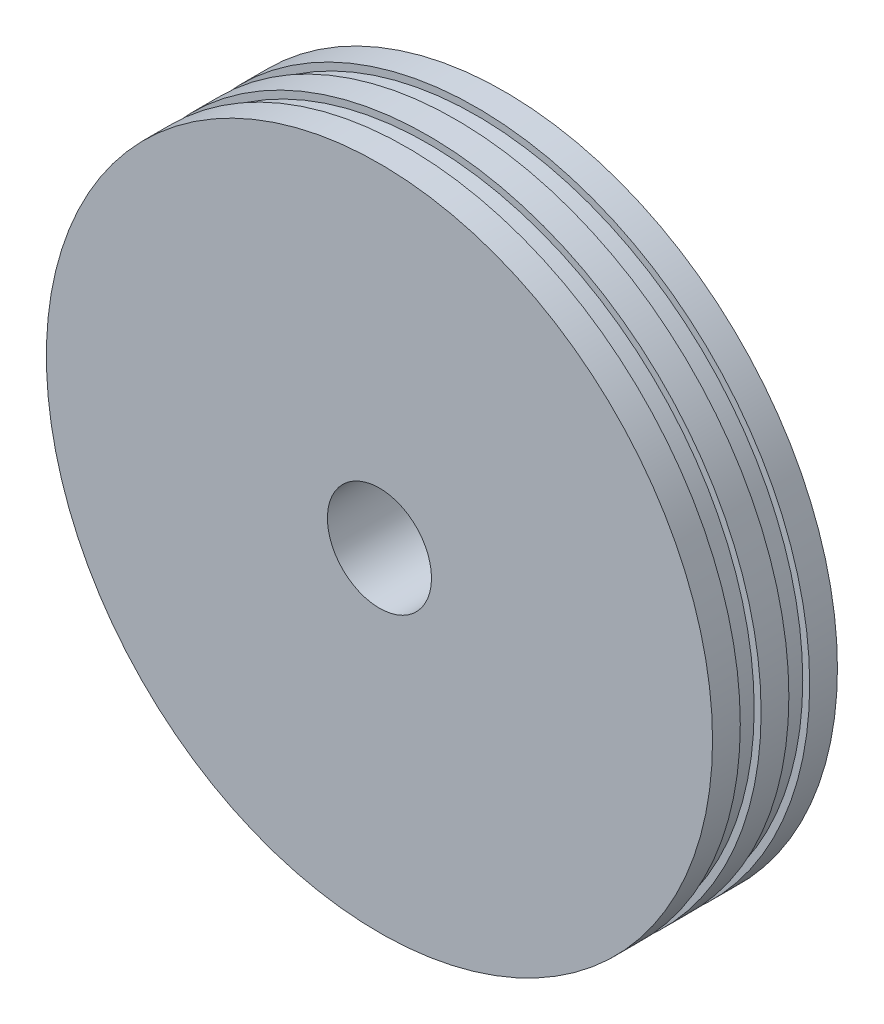
ISO-10303-21;
HEADER;
FILE_DESCRIPTION(('STEP AP214'),'2;1');
FILE_NAME('part.step','',(''),(''),'','','');
FILE_SCHEMA(('AUTOMOTIVE_DESIGN { 1 0 10303 214 1 1 1 1 }'));
ENDSEC;
DATA;
#1=APPLICATION_CONTEXT('core data for automotive mechanical design processes');
#2=APPLICATION_PROTOCOL_DEFINITION('international standard','automotive_design',2000,#1);
#3=PRODUCT_CONTEXT('',#1,'mechanical');
#4=PRODUCT('Part','Part','',(#3));
#5=PRODUCT_RELATED_PRODUCT_CATEGORY('part','',(#4));
#6=PRODUCT_DEFINITION_FORMATION('','',#4);
#7=PRODUCT_DEFINITION_CONTEXT('part definition',#1,'design');
#8=PRODUCT_DEFINITION('design','',#6,#7);
#9=PRODUCT_DEFINITION_SHAPE('','',#8);
#10=(LENGTH_UNIT() NAMED_UNIT(*) SI_UNIT(.MILLI.,.METRE.));
#11=(NAMED_UNIT(*) PLANE_ANGLE_UNIT() SI_UNIT($,.RADIAN.));
#12=(NAMED_UNIT(*) SI_UNIT($,.STERADIAN.) SOLID_ANGLE_UNIT());
#13=UNCERTAINTY_MEASURE_WITH_UNIT(LENGTH_MEASURE(1.E-05),#10,'distance_accuracy_value','');
#14=(GEOMETRIC_REPRESENTATION_CONTEXT(3) GLOBAL_UNCERTAINTY_ASSIGNED_CONTEXT((#13)) GLOBAL_UNIT_ASSIGNED_CONTEXT((#10,
#11,#12)) REPRESENTATION_CONTEXT('',''));
#15=CARTESIAN_POINT('',(0.,0.,0.));
#16=DIRECTION('',(0.,0.,1.));
#17=DIRECTION('',(1.,0.,0.));
#18=AXIS2_PLACEMENT_3D('',#15,#16,#17);
#19=CARTESIAN_POINT('',(0.,0.,10.));
#20=DIRECTION('',(0.,0.,-1.));
#21=DIRECTION('',(-1.,0.,0.));
#22=AXIS2_PLACEMENT_3D('',#19,#20,#21);
#23=CYLINDRICAL_SURFACE('',#22,120.);
#24=CARTESIAN_POINT('',(0.,0.,10.));
#25=DIRECTION('',(0.,0.,1.));
#26=DIRECTION('',(1.,0.,0.));
#27=AXIS2_PLACEMENT_3D('',#24,#25,#26);
#28=CIRCLE('',#27,120.);
#29=CARTESIAN_POINT('',(120.,0.,10.));
#30=VERTEX_POINT('',#29);
#31=EDGE_CURVE('E48',#30,#30,#28,.T.);
#32=ORIENTED_EDGE('',*,*,#31,.F.);
#33=EDGE_LOOP('',(#32));
#34=FACE_BOUND('',#33,.T.);
#35=CARTESIAN_POINT('',(0.,0.,0.));
#36=DIRECTION('',(0.,0.,1.));
#37=DIRECTION('',(1.,0.,0.));
#38=AXIS2_PLACEMENT_3D('',#35,#36,#37);
#39=CIRCLE('',#38,120.);
#40=CARTESIAN_POINT('',(120.,0.,0.));
#41=VERTEX_POINT('',#40);
#42=EDGE_CURVE('E39',#41,#41,#39,.T.);
#43=ORIENTED_EDGE('',*,*,#42,.T.);
#44=EDGE_LOOP('',(#43));
#45=FACE_BOUND('',#44,.T.);
#46=ADVANCED_FACE('F36',(#34,#45),#23,.T.);
#47=CARTESIAN_POINT('',(0.,0.,10.));
#48=DIRECTION('',(0.,0.,1.));
#49=DIRECTION('',(1.,0.,0.));
#50=AXIS2_PLACEMENT_3D('',#47,#48,#49);
#51=PLANE('',#50);
#52=CARTESIAN_POINT('',(0.,0.,10.));
#53=DIRECTION('',(0.,0.,1.));
#54=DIRECTION('',(1.,0.,0.));
#55=AXIS2_PLACEMENT_3D('',#52,#53,#54);
#56=CIRCLE('',#55,117.5);
#57=CARTESIAN_POINT('',(117.5,0.,10.));
#58=VERTEX_POINT('',#57);
#59=EDGE_CURVE('E43',#58,#58,#56,.T.);
#60=ORIENTED_EDGE('',*,*,#59,.F.);
#61=EDGE_LOOP('',(#60));
#62=FACE_BOUND('',#61,.T.);
#63=ORIENTED_EDGE('',*,*,#31,.T.);
#64=EDGE_LOOP('',(#63));
#65=FACE_BOUND('',#64,.T.);
#66=ADVANCED_FACE('F72',(#62,#65),#51,.T.);
#67=CARTESIAN_POINT('',(0.,0.,0.));
#68=DIRECTION('',(0.,0.,1.));
#69=DIRECTION('',(1.,0.,0.));
#70=AXIS2_PLACEMENT_3D('',#67,#68,#69);
#71=PLANE('',#70);
#72=CARTESIAN_POINT('',(0.,0.,0.));
#73=DIRECTION('',(0.,0.,1.));
#74=DIRECTION('',(1.,0.,0.));
#75=AXIS2_PLACEMENT_3D('',#72,#73,#74);
#76=CIRCLE('',#75,18.75);
#77=CARTESIAN_POINT('',(18.75,0.,0.));
#78=VERTEX_POINT('',#77);
#79=EDGE_CURVE('E190',#78,#78,#76,.T.);
#80=ORIENTED_EDGE('',*,*,#79,.T.);
#81=EDGE_LOOP('',(#80));
#82=FACE_BOUND('',#81,.T.);
#83=ORIENTED_EDGE('',*,*,#42,.F.);
#84=EDGE_LOOP('',(#83));
#85=FACE_BOUND('',#84,.T.);
#86=ADVANCED_FACE('F69',(#82,#85),#71,.F.);
#87=CARTESIAN_POINT('',(0.,0.,17.5));
#88=DIRECTION('',(0.,0.,-1.));
#89=DIRECTION('',(-1.,0.,0.));
#90=AXIS2_PLACEMENT_3D('',#87,#88,#89);
#91=CYLINDRICAL_SURFACE('',#90,117.5);
#92=CARTESIAN_POINT('',(0.,0.,17.5));
#93=DIRECTION('',(0.,0.,1.));
#94=DIRECTION('',(1.,0.,0.));
#95=AXIS2_PLACEMENT_3D('',#92,#93,#94);
#96=CIRCLE('',#95,117.5);
#97=CARTESIAN_POINT('',(117.5,0.,17.5));
#98=VERTEX_POINT('',#97);
#99=EDGE_CURVE('E57',#98,#98,#96,.T.);
#100=ORIENTED_EDGE('',*,*,#99,.F.);
#101=EDGE_LOOP('',(#100));
#102=FACE_BOUND('',#101,.T.);
#103=ORIENTED_EDGE('',*,*,#59,.T.);
#104=EDGE_LOOP('',(#103));
#105=FACE_BOUND('',#104,.T.);
#106=ADVANCED_FACE('F71',(#102,#105),#91,.T.);
#107=CARTESIAN_POINT('',(0.,0.,27.5));
#108=DIRECTION('',(0.,0.,-1.));
#109=DIRECTION('',(-1.,0.,0.));
#110=AXIS2_PLACEMENT_3D('',#107,#108,#109);
#111=CYLINDRICAL_SURFACE('',#110,120.);
#112=CARTESIAN_POINT('',(0.,0.,27.5));
#113=DIRECTION('',(0.,0.,1.));
#114=DIRECTION('',(1.,0.,0.));
#115=AXIS2_PLACEMENT_3D('',#112,#113,#114);
#116=CIRCLE('',#115,120.);
#117=CARTESIAN_POINT('',(120.,0.,27.5));
#118=VERTEX_POINT('',#117);
#119=EDGE_CURVE('E54',#118,#118,#116,.T.);
#120=ORIENTED_EDGE('',*,*,#119,.F.);
#121=EDGE_LOOP('',(#120));
#122=FACE_BOUND('',#121,.T.);
#123=CARTESIAN_POINT('',(0.,0.,17.5));
#124=DIRECTION('',(0.,0.,1.));
#125=DIRECTION('',(1.,0.,0.));
#126=AXIS2_PLACEMENT_3D('',#123,#124,#125);
#127=CIRCLE('',#126,120.);
#128=CARTESIAN_POINT('',(120.,0.,17.5));
#129=VERTEX_POINT('',#128);
#130=EDGE_CURVE('E58',#129,#129,#127,.T.);
#131=ORIENTED_EDGE('',*,*,#130,.T.);
#132=EDGE_LOOP('',(#131));
#133=FACE_BOUND('',#132,.T.);
#134=ADVANCED_FACE('F78',(#122,#133),#111,.T.);
#135=CARTESIAN_POINT('',(0.,0.,27.5));
#136=DIRECTION('',(0.,0.,1.));
#137=DIRECTION('',(1.,0.,0.));
#138=AXIS2_PLACEMENT_3D('',#135,#136,#137);
#139=PLANE('',#138);
#140=CARTESIAN_POINT('',(0.,0.,27.5));
#141=DIRECTION('',(0.,0.,1.));
#142=DIRECTION('',(1.,0.,0.));
#143=AXIS2_PLACEMENT_3D('',#140,#141,#142);
#144=CIRCLE('',#143,117.5);
#145=CARTESIAN_POINT('',(117.5,0.,27.5));
#146=VERTEX_POINT('',#145);
#147=EDGE_CURVE('E10',#146,#146,#144,.T.);
#148=ORIENTED_EDGE('',*,*,#147,.F.);
#149=EDGE_LOOP('',(#148));
#150=FACE_BOUND('',#149,.T.);
#151=ORIENTED_EDGE('',*,*,#119,.T.);
#152=EDGE_LOOP('',(#151));
#153=FACE_BOUND('',#152,.T.);
#154=ADVANCED_FACE('F108',(#150,#153),#139,.T.);
#155=CARTESIAN_POINT('',(0.,0.,17.5));
#156=DIRECTION('',(0.,0.,1.));
#157=DIRECTION('',(1.,0.,0.));
#158=AXIS2_PLACEMENT_3D('',#155,#156,#157);
#159=PLANE('',#158);
#160=ORIENTED_EDGE('',*,*,#99,.T.);
#161=EDGE_LOOP('',(#160));
#162=FACE_BOUND('',#161,.T.);
#163=ORIENTED_EDGE('',*,*,#130,.F.);
#164=EDGE_LOOP('',(#163));
#165=FACE_BOUND('',#164,.T.);
#166=ADVANCED_FACE('F116',(#162,#165),#159,.F.);
#167=CARTESIAN_POINT('',(0.,0.,35.));
#168=DIRECTION('',(0.,0.,-1.));
#169=DIRECTION('',(-1.,0.,0.));
#170=AXIS2_PLACEMENT_3D('',#167,#168,#169);
#171=CYLINDRICAL_SURFACE('',#170,117.5);
#172=CARTESIAN_POINT('',(0.,0.,35.));
#173=DIRECTION('',(0.,0.,1.));
#174=DIRECTION('',(1.,0.,0.));
#175=AXIS2_PLACEMENT_3D('',#172,#173,#174);
#176=CIRCLE('',#175,117.5);
#177=CARTESIAN_POINT('',(117.5,0.,35.));
#178=VERTEX_POINT('',#177);
#179=EDGE_CURVE('E52',#178,#178,#176,.T.);
#180=ORIENTED_EDGE('',*,*,#179,.F.);
#181=EDGE_LOOP('',(#180));
#182=FACE_BOUND('',#181,.T.);
#183=ORIENTED_EDGE('',*,*,#147,.T.);
#184=EDGE_LOOP('',(#183));
#185=FACE_BOUND('',#184,.T.);
#186=ADVANCED_FACE('F121',(#182,#185),#171,.T.);
#187=CARTESIAN_POINT('',(0.,0.,45.));
#188=DIRECTION('',(0.,0.,-1.));
#189=DIRECTION('',(-1.,0.,0.));
#190=AXIS2_PLACEMENT_3D('',#187,#188,#189);
#191=CYLINDRICAL_SURFACE('',#190,120.);
#192=CARTESIAN_POINT('',(0.,0.,45.));
#193=DIRECTION('',(0.,0.,1.));
#194=DIRECTION('',(1.,0.,0.));
#195=AXIS2_PLACEMENT_3D('',#192,#193,#194);
#196=CIRCLE('',#195,120.);
#197=CARTESIAN_POINT('',(120.,0.,45.));
#198=VERTEX_POINT('',#197);
#199=EDGE_CURVE('E194',#198,#198,#196,.T.);
#200=ORIENTED_EDGE('',*,*,#199,.F.);
#201=EDGE_LOOP('',(#200));
#202=FACE_BOUND('',#201,.T.);
#203=CARTESIAN_POINT('',(0.,0.,35.));
#204=DIRECTION('',(0.,0.,1.));
#205=DIRECTION('',(1.,0.,0.));
#206=AXIS2_PLACEMENT_3D('',#203,#204,#205);
#207=CIRCLE('',#206,120.);
#208=CARTESIAN_POINT('',(120.,0.,35.));
#209=VERTEX_POINT('',#208);
#210=EDGE_CURVE('E191',#209,#209,#207,.T.);
#211=ORIENTED_EDGE('',*,*,#210,.T.);
#212=EDGE_LOOP('',(#211));
#213=FACE_BOUND('',#212,.T.);
#214=ADVANCED_FACE('F138',(#202,#213),#191,.T.);
#215=CARTESIAN_POINT('',(0.,0.,45.));
#216=DIRECTION('',(0.,0.,1.));
#217=DIRECTION('',(1.,0.,0.));
#218=AXIS2_PLACEMENT_3D('',#215,#216,#217);
#219=PLANE('',#218);
#220=CARTESIAN_POINT('',(0.,0.,45.));
#221=DIRECTION('',(0.,0.,1.));
#222=DIRECTION('',(1.,0.,0.));
#223=AXIS2_PLACEMENT_3D('',#220,#221,#222);
#224=CIRCLE('',#223,18.75);
#225=CARTESIAN_POINT('',(18.75,0.,45.));
#226=VERTEX_POINT('',#225);
#227=EDGE_CURVE('E188',#226,#226,#224,.T.);
#228=ORIENTED_EDGE('',*,*,#227,.F.);
#229=EDGE_LOOP('',(#228));
#230=FACE_BOUND('',#229,.T.);
#231=ORIENTED_EDGE('',*,*,#199,.T.);
#232=EDGE_LOOP('',(#231));
#233=FACE_BOUND('',#232,.T.);
#234=ADVANCED_FACE('F148',(#230,#233),#219,.T.);
#235=CARTESIAN_POINT('',(0.,0.,35.));
#236=DIRECTION('',(0.,0.,1.));
#237=DIRECTION('',(1.,0.,0.));
#238=AXIS2_PLACEMENT_3D('',#235,#236,#237);
#239=PLANE('',#238);
#240=ORIENTED_EDGE('',*,*,#179,.T.);
#241=EDGE_LOOP('',(#240));
#242=FACE_BOUND('',#241,.T.);
#243=ORIENTED_EDGE('',*,*,#210,.F.);
#244=EDGE_LOOP('',(#243));
#245=FACE_BOUND('',#244,.T.);
#246=ADVANCED_FACE('F156',(#242,#245),#239,.F.);
#247=CARTESIAN_POINT('',(0.,0.,-5.));
#248=DIRECTION('',(0.,0.,1.));
#249=DIRECTION('',(1.,0.,0.));
#250=AXIS2_PLACEMENT_3D('',#247,#248,#249);
#251=CYLINDRICAL_SURFACE('',#250,18.75);
#252=ORIENTED_EDGE('',*,*,#227,.T.);
#253=EDGE_LOOP('',(#252));
#254=FACE_BOUND('',#253,.T.);
#255=ORIENTED_EDGE('',*,*,#79,.F.);
#256=EDGE_LOOP('',(#255));
#257=FACE_BOUND('',#256,.T.);
#258=ADVANCED_FACE('F160',(#254,#257),#251,.F.);
#259=CLOSED_SHELL('',(#46,#66,#86,#106,#134,#154,#166,#186,#214,#234,#246,#258));
#260=MANIFOLD_SOLID_BREP('B2',#259);
#261=ADVANCED_BREP_SHAPE_REPRESENTATION('',(#18,#260),#14);
#262=SHAPE_DEFINITION_REPRESENTATION(#9,#261);
ENDSEC;
END-ISO-10303-21;
